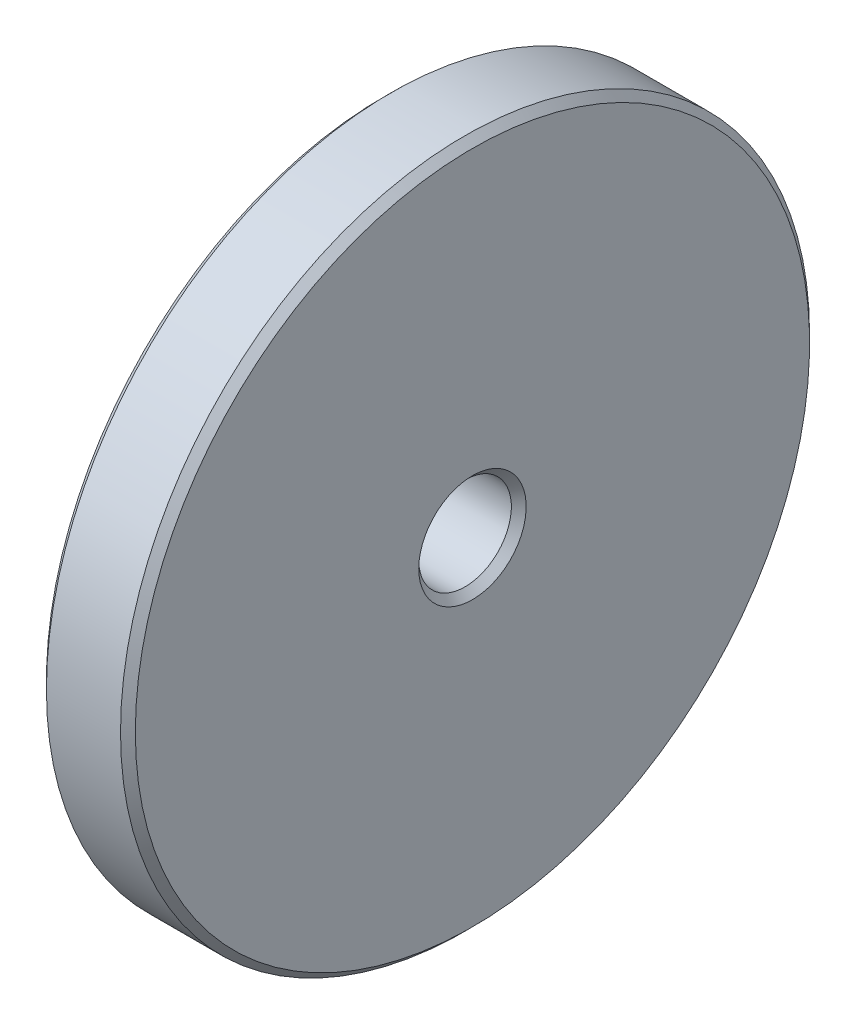
ISO-10303-21;
HEADER;
FILE_DESCRIPTION(('STEP AP214'),'2;1');
FILE_NAME('part.step','',(''),(''),'','','');
FILE_SCHEMA(('AUTOMOTIVE_DESIGN { 1 0 10303 214 1 1 1 1 }'));
ENDSEC;
DATA;
#1=APPLICATION_CONTEXT('core data for automotive mechanical design processes');
#2=APPLICATION_PROTOCOL_DEFINITION('international standard','automotive_design',2000,#1);
#3=PRODUCT_CONTEXT('',#1,'mechanical');
#4=PRODUCT('Part','Part','',(#3));
#5=PRODUCT_RELATED_PRODUCT_CATEGORY('part','',(#4));
#6=PRODUCT_DEFINITION_FORMATION('','',#4);
#7=PRODUCT_DEFINITION_CONTEXT('part definition',#1,'design');
#8=PRODUCT_DEFINITION('design','',#6,#7);
#9=PRODUCT_DEFINITION_SHAPE('','',#8);
#10=(LENGTH_UNIT() NAMED_UNIT(*) SI_UNIT(.MILLI.,.METRE.));
#11=(NAMED_UNIT(*) PLANE_ANGLE_UNIT() SI_UNIT($,.RADIAN.));
#12=(NAMED_UNIT(*) SI_UNIT($,.STERADIAN.) SOLID_ANGLE_UNIT());
#13=UNCERTAINTY_MEASURE_WITH_UNIT(LENGTH_MEASURE(1.E-05),#10,'distance_accuracy_value','');
#14=(GEOMETRIC_REPRESENTATION_CONTEXT(3) GLOBAL_UNCERTAINTY_ASSIGNED_CONTEXT((#13)) GLOBAL_UNIT_ASSIGNED_CONTEXT((#10,
#11,#12)) REPRESENTATION_CONTEXT('',''));
#15=CARTESIAN_POINT('',(0.,0.,0.));
#16=DIRECTION('',(0.,0.,1.));
#17=DIRECTION('',(1.,0.,0.));
#18=AXIS2_PLACEMENT_3D('',#15,#16,#17);
#19=CARTESIAN_POINT('',(-17.9030272452069,0.,0.));
#20=DIRECTION('',(-1.,0.,0.));
#21=DIRECTION('',(0.,0.,1.));
#22=AXIS2_PLACEMENT_3D('',#19,#20,#21);
#23=CYLINDRICAL_SURFACE('',#22,6.25);
#24=CARTESIAN_POINT('',(-2.23843955363305,0.,0.));
#25=DIRECTION('',(-1.,0.,0.));
#26=DIRECTION('',(0.,0.,1.));
#27=AXIS2_PLACEMENT_3D('',#24,#25,#26);
#28=CIRCLE('',#27,6.25);
#29=CARTESIAN_POINT('',(-2.23843955363305,0.,6.25));
#30=VERTEX_POINT('',#29);
#31=EDGE_CURVE('E50',#30,#30,#28,.F.);
#32=ORIENTED_EDGE('',*,*,#31,.T.);
#33=EDGE_LOOP('',(#32));
#34=FACE_BOUND('',#33,.T.);
#35=CARTESIAN_POINT('',(-12.2384395536331,0.,0.));
#36=DIRECTION('',(1.,0.,0.));
#37=DIRECTION('',(0.,0.,-1.));
#38=AXIS2_PLACEMENT_3D('',#35,#36,#37);
#39=CIRCLE('',#38,6.25);
#40=CARTESIAN_POINT('',(-12.2384395536331,0.,-6.25));
#41=VERTEX_POINT('',#40);
#42=EDGE_CURVE('E53',#41,#41,#39,.F.);
#43=ORIENTED_EDGE('',*,*,#42,.T.);
#44=EDGE_LOOP('',(#43));
#45=FACE_BOUND('',#44,.T.);
#46=ADVANCED_FACE('F30',(#34,#45),#23,.F.);
#47=CARTESIAN_POINT('',(-13.2384395536331,6.25,0.));
#48=DIRECTION('',(1.,0.,0.));
#49=DIRECTION('',(0.,0.,-1.));
#50=AXIS2_PLACEMENT_3D('',#47,#48,#49);
#51=PLANE('',#50);
#52=CARTESIAN_POINT('',(-13.2384395536331,0.,0.));
#53=DIRECTION('',(1.,0.,0.));
#54=DIRECTION('',(0.,0.,-1.));
#55=AXIS2_PLACEMENT_3D('',#52,#53,#54);
#56=CIRCLE('',#55,45.5000000000001);
#57=CARTESIAN_POINT('',(-13.2384395536331,0.,-45.5000000000001));
#58=VERTEX_POINT('',#57);
#59=EDGE_CURVE('E10',#58,#58,#56,.F.);
#60=ORIENTED_EDGE('',*,*,#59,.T.);
#61=EDGE_LOOP('',(#60));
#62=FACE_BOUND('',#61,.T.);
#63=CARTESIAN_POINT('',(-13.2384395536331,0.,0.));
#64=DIRECTION('',(1.,0.,0.));
#65=DIRECTION('',(0.,0.,-1.));
#66=AXIS2_PLACEMENT_3D('',#63,#64,#65);
#67=CIRCLE('',#66,7.24999999999999);
#68=CARTESIAN_POINT('',(-13.2384395536331,0.,-7.24999999999999));
#69=VERTEX_POINT('',#68);
#70=EDGE_CURVE('E37',#69,#69,#67,.T.);
#71=ORIENTED_EDGE('',*,*,#70,.T.);
#72=EDGE_LOOP('',(#71));
#73=FACE_BOUND('',#72,.T.);
#74=ADVANCED_FACE('F76',(#62,#73),#51,.F.);
#75=CARTESIAN_POINT('',(-17.9030272452069,0.,0.));
#76=DIRECTION('',(-1.,0.,0.));
#77=DIRECTION('',(0.,0.,1.));
#78=AXIS2_PLACEMENT_3D('',#75,#76,#77);
#79=CYLINDRICAL_SURFACE('',#78,46.5);
#80=CARTESIAN_POINT('',(-2.23843955363306,0.,0.));
#81=DIRECTION('',(-1.,0.,0.));
#82=DIRECTION('',(0.,0.,1.));
#83=AXIS2_PLACEMENT_3D('',#80,#81,#82);
#84=CIRCLE('',#83,46.5);
#85=CARTESIAN_POINT('',(-2.23843955363306,0.,46.5));
#86=VERTEX_POINT('',#85);
#87=EDGE_CURVE('E41',#86,#86,#84,.T.);
#88=ORIENTED_EDGE('',*,*,#87,.T.);
#89=EDGE_LOOP('',(#88));
#90=FACE_BOUND('',#89,.T.);
#91=CARTESIAN_POINT('',(-12.2384395536331,0.,0.));
#92=DIRECTION('',(1.,0.,0.));
#93=DIRECTION('',(0.,0.,-1.));
#94=AXIS2_PLACEMENT_3D('',#91,#92,#93);
#95=CIRCLE('',#94,46.5);
#96=CARTESIAN_POINT('',(-12.2384395536331,0.,-46.5));
#97=VERTEX_POINT('',#96);
#98=EDGE_CURVE('E45',#97,#97,#95,.T.);
#99=ORIENTED_EDGE('',*,*,#98,.T.);
#100=EDGE_LOOP('',(#99));
#101=FACE_BOUND('',#100,.T.);
#102=ADVANCED_FACE('F73',(#90,#101),#79,.T.);
#103=CARTESIAN_POINT('',(-1.23843955363305,46.5,0.));
#104=DIRECTION('',(-1.,0.,0.));
#105=DIRECTION('',(0.,0.,1.));
#106=AXIS2_PLACEMENT_3D('',#103,#104,#105);
#107=PLANE('',#106);
#108=CARTESIAN_POINT('',(-1.23843955363305,0.,0.));
#109=DIRECTION('',(-1.,0.,0.));
#110=DIRECTION('',(0.,0.,1.));
#111=AXIS2_PLACEMENT_3D('',#108,#109,#110);
#112=CIRCLE('',#111,7.25000000000001);
#113=CARTESIAN_POINT('',(-1.23843955363305,0.,7.25000000000001));
#114=VERTEX_POINT('',#113);
#115=EDGE_CURVE('E56',#114,#114,#112,.T.);
#116=ORIENTED_EDGE('',*,*,#115,.T.);
#117=EDGE_LOOP('',(#116));
#118=FACE_BOUND('',#117,.T.);
#119=CARTESIAN_POINT('',(-1.23843955363305,0.,0.));
#120=DIRECTION('',(-1.,0.,0.));
#121=DIRECTION('',(0.,0.,1.));
#122=AXIS2_PLACEMENT_3D('',#119,#120,#121);
#123=CIRCLE('',#122,45.5);
#124=CARTESIAN_POINT('',(-1.23843955363305,0.,45.5));
#125=VERTEX_POINT('',#124);
#126=EDGE_CURVE('E59',#125,#125,#123,.F.);
#127=ORIENTED_EDGE('',*,*,#126,.T.);
#128=EDGE_LOOP('',(#127));
#129=FACE_BOUND('',#128,.T.);
#130=ADVANCED_FACE('F63',(#118,#129),#107,.F.);
#131=CARTESIAN_POINT('',(-1.23843955363305,0.,0.));
#132=DIRECTION('',(1.,0.,0.));
#133=DIRECTION('',(0.,0.,-1.));
#134=AXIS2_PLACEMENT_3D('',#131,#132,#133);
#135=CONICAL_SURFACE('',#134,7.25000000000001,0.785398163397452);
#136=ORIENTED_EDGE('',*,*,#31,.F.);
#137=EDGE_LOOP('',(#136));
#138=FACE_BOUND('',#137,.T.);
#139=ORIENTED_EDGE('',*,*,#115,.F.);
#140=EDGE_LOOP('',(#139));
#141=FACE_BOUND('',#140,.T.);
#142=ADVANCED_FACE('F69',(#138,#141),#135,.F.);
#143=CARTESIAN_POINT('',(-2.23843955363306,0.,0.));
#144=DIRECTION('',(-1.,0.,0.));
#145=DIRECTION('',(0.,0.,1.));
#146=AXIS2_PLACEMENT_3D('',#143,#144,#145);
#147=CONICAL_SURFACE('',#146,46.5,0.785398163397445);
#148=ORIENTED_EDGE('',*,*,#126,.F.);
#149=EDGE_LOOP('',(#148));
#150=FACE_BOUND('',#149,.T.);
#151=ORIENTED_EDGE('',*,*,#87,.F.);
#152=EDGE_LOOP('',(#151));
#153=FACE_BOUND('',#152,.T.);
#154=ADVANCED_FACE('F65',(#150,#153),#147,.T.);
#155=CARTESIAN_POINT('',(-13.2384395536331,0.,0.));
#156=DIRECTION('',(1.,0.,0.));
#157=DIRECTION('',(0.,0.,-1.));
#158=AXIS2_PLACEMENT_3D('',#155,#156,#157);
#159=CONICAL_SURFACE('',#158,45.5000000000001,0.785398163397445);
#160=ORIENTED_EDGE('',*,*,#98,.F.);
#161=EDGE_LOOP('',(#160));
#162=FACE_BOUND('',#161,.T.);
#163=ORIENTED_EDGE('',*,*,#59,.F.);
#164=EDGE_LOOP('',(#163));
#165=FACE_BOUND('',#164,.T.);
#166=ADVANCED_FACE('F68',(#162,#165),#159,.T.);
#167=CARTESIAN_POINT('',(-12.2384395536331,0.,0.));
#168=DIRECTION('',(-1.,0.,0.));
#169=DIRECTION('',(0.,0.,1.));
#170=AXIS2_PLACEMENT_3D('',#167,#168,#169);
#171=CONICAL_SURFACE('',#170,6.25,0.785398163397444);
#172=ORIENTED_EDGE('',*,*,#70,.F.);
#173=EDGE_LOOP('',(#172));
#174=FACE_BOUND('',#173,.T.);
#175=ORIENTED_EDGE('',*,*,#42,.F.);
#176=EDGE_LOOP('',(#175));
#177=FACE_BOUND('',#176,.T.);
#178=ADVANCED_FACE('F32',(#174,#177),#171,.F.);
#179=CLOSED_SHELL('',(#46,#74,#102,#130,#142,#154,#166,#178));
#180=MANIFOLD_SOLID_BREP('B2',#179);
#181=ADVANCED_BREP_SHAPE_REPRESENTATION('',(#18,#180),#14);
#182=SHAPE_DEFINITION_REPRESENTATION(#9,#181);
ENDSEC;
END-ISO-10303-21;
